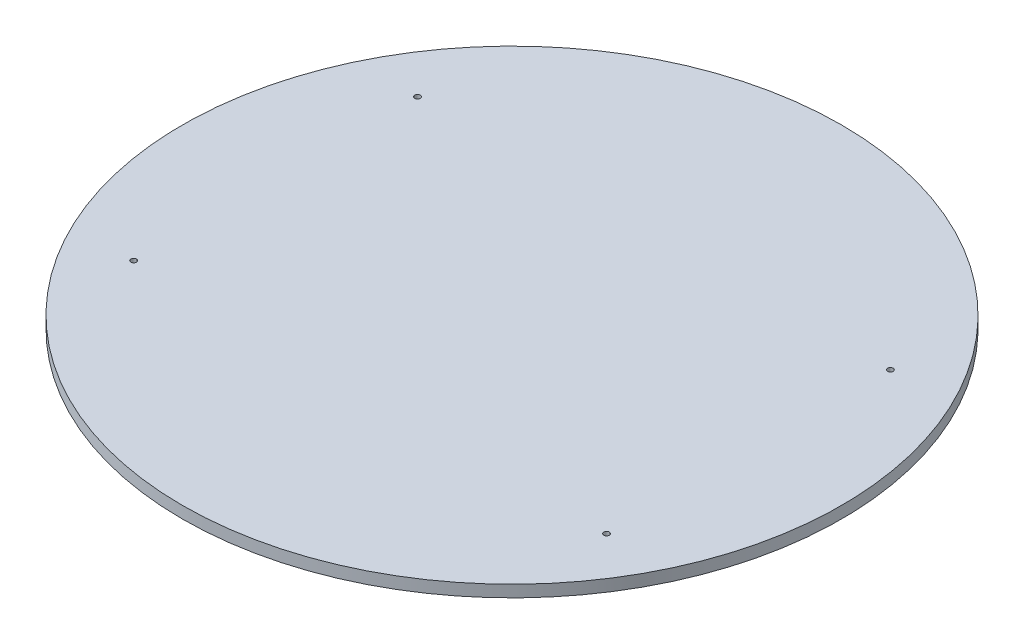
ISO-10303-21;
HEADER;
FILE_DESCRIPTION(('STEP AP214'),'2;1');
FILE_NAME('part.step','',(''),(''),'','','');
FILE_SCHEMA(('AUTOMOTIVE_DESIGN { 1 0 10303 214 1 1 1 1 }'));
ENDSEC;
DATA;
#1=APPLICATION_CONTEXT('core data for automotive mechanical design processes');
#2=APPLICATION_PROTOCOL_DEFINITION('international standard','automotive_design',2000,#1);
#3=PRODUCT_CONTEXT('',#1,'mechanical');
#4=PRODUCT('Part','Part','',(#3));
#5=PRODUCT_RELATED_PRODUCT_CATEGORY('part','',(#4));
#6=PRODUCT_DEFINITION_FORMATION('','',#4);
#7=PRODUCT_DEFINITION_CONTEXT('part definition',#1,'design');
#8=PRODUCT_DEFINITION('design','',#6,#7);
#9=PRODUCT_DEFINITION_SHAPE('','',#8);
#10=(LENGTH_UNIT() NAMED_UNIT(*) SI_UNIT(.MILLI.,.METRE.));
#11=(NAMED_UNIT(*) PLANE_ANGLE_UNIT() SI_UNIT($,.RADIAN.));
#12=(NAMED_UNIT(*) SI_UNIT($,.STERADIAN.) SOLID_ANGLE_UNIT());
#13=UNCERTAINTY_MEASURE_WITH_UNIT(LENGTH_MEASURE(1.E-05),#10,'distance_accuracy_value','');
#14=(GEOMETRIC_REPRESENTATION_CONTEXT(3) GLOBAL_UNCERTAINTY_ASSIGNED_CONTEXT((#13)) GLOBAL_UNIT_ASSIGNED_CONTEXT((#10,
#11,#12)) REPRESENTATION_CONTEXT('',''));
#15=CARTESIAN_POINT('',(0.,0.,0.));
#16=DIRECTION('',(0.,0.,1.));
#17=DIRECTION('',(1.,0.,0.));
#18=AXIS2_PLACEMENT_3D('',#15,#16,#17);
#19=CARTESIAN_POINT('',(0.,6.35,0.));
#20=DIRECTION('',(0.,1.,0.));
#21=DIRECTION('',(0.,0.,1.));
#22=AXIS2_PLACEMENT_3D('',#19,#20,#21);
#23=PLANE('',#22);
#24=CARTESIAN_POINT('',(127.,6.35,-76.2));
#25=DIRECTION('',(0.,1.,0.));
#26=DIRECTION('',(0.,0.,1.));
#27=AXIS2_PLACEMENT_3D('',#24,#25,#26);
#28=CIRCLE('',#27,1.5);
#29=CARTESIAN_POINT('',(127.,6.35,-74.7));
#30=VERTEX_POINT('',#29);
#31=EDGE_CURVE('E57',#30,#30,#28,.T.);
#32=ORIENTED_EDGE('',*,*,#31,.F.);
#33=EDGE_LOOP('',(#32));
#34=FACE_BOUND('',#33,.T.);
#35=CARTESIAN_POINT('',(-127.,6.35,76.2));
#36=DIRECTION('',(0.,1.,0.));
#37=DIRECTION('',(0.,0.,1.));
#38=AXIS2_PLACEMENT_3D('',#35,#36,#37);
#39=CIRCLE('',#38,1.5);
#40=CARTESIAN_POINT('',(-127.,6.35,77.7));
#41=VERTEX_POINT('',#40);
#42=EDGE_CURVE('E46',#41,#41,#39,.T.);
#43=ORIENTED_EDGE('',*,*,#42,.F.);
#44=EDGE_LOOP('',(#43));
#45=FACE_BOUND('',#44,.T.);
#46=CARTESIAN_POINT('',(0.,6.35,0.));
#47=DIRECTION('',(0.,1.,0.));
#48=DIRECTION('',(0.,0.,1.));
#49=AXIS2_PLACEMENT_3D('',#46,#47,#48);
#50=CIRCLE('',#49,177.);
#51=CARTESIAN_POINT('',(0.,6.35,177.));
#52=VERTEX_POINT('',#51);
#53=EDGE_CURVE('E10',#52,#52,#50,.T.);
#54=ORIENTED_EDGE('',*,*,#53,.T.);
#55=EDGE_LOOP('',(#54));
#56=FACE_BOUND('',#55,.T.);
#57=CARTESIAN_POINT('',(-127.,6.35,-76.2));
#58=DIRECTION('',(0.,1.,0.));
#59=DIRECTION('',(0.,0.,1.));
#60=AXIS2_PLACEMENT_3D('',#57,#58,#59);
#61=CIRCLE('',#60,1.5);
#62=CARTESIAN_POINT('',(-127.,6.35,-74.7));
#63=VERTEX_POINT('',#62);
#64=EDGE_CURVE('E51',#63,#63,#61,.T.);
#65=ORIENTED_EDGE('',*,*,#64,.F.);
#66=EDGE_LOOP('',(#65));
#67=FACE_BOUND('',#66,.T.);
#68=CARTESIAN_POINT('',(127.,6.35,76.2));
#69=DIRECTION('',(0.,1.,0.));
#70=DIRECTION('',(0.,0.,1.));
#71=AXIS2_PLACEMENT_3D('',#68,#69,#70);
#72=CIRCLE('',#71,1.5);
#73=CARTESIAN_POINT('',(127.,6.35,77.7));
#74=VERTEX_POINT('',#73);
#75=EDGE_CURVE('E63',#74,#74,#72,.T.);
#76=ORIENTED_EDGE('',*,*,#75,.F.);
#77=EDGE_LOOP('',(#76));
#78=FACE_BOUND('',#77,.T.);
#79=ADVANCED_FACE('F35',(#34,#45,#56,#67,#78),#23,.T.);
#80=CARTESIAN_POINT('',(0.,0.,0.));
#81=DIRECTION('',(0.,1.,0.));
#82=DIRECTION('',(0.,0.,1.));
#83=AXIS2_PLACEMENT_3D('',#80,#81,#82);
#84=PLANE('',#83);
#85=CARTESIAN_POINT('',(0.,0.,0.));
#86=DIRECTION('',(0.,1.,0.));
#87=DIRECTION('',(0.,0.,1.));
#88=AXIS2_PLACEMENT_3D('',#85,#86,#87);
#89=CIRCLE('',#88,177.);
#90=CARTESIAN_POINT('',(0.,0.,177.));
#91=VERTEX_POINT('',#90);
#92=EDGE_CURVE('E39',#91,#91,#89,.T.);
#93=ORIENTED_EDGE('',*,*,#92,.F.);
#94=EDGE_LOOP('',(#93));
#95=FACE_BOUND('',#94,.T.);
#96=CARTESIAN_POINT('',(-127.,0.,76.2));
#97=DIRECTION('',(0.,1.,0.));
#98=DIRECTION('',(0.,0.,1.));
#99=AXIS2_PLACEMENT_3D('',#96,#97,#98);
#100=CIRCLE('',#99,1.5);
#101=CARTESIAN_POINT('',(-127.,0.,77.7));
#102=VERTEX_POINT('',#101);
#103=EDGE_CURVE('E48',#102,#102,#100,.T.);
#104=ORIENTED_EDGE('',*,*,#103,.T.);
#105=EDGE_LOOP('',(#104));
#106=FACE_BOUND('',#105,.T.);
#107=CARTESIAN_POINT('',(-127.,0.,-76.2));
#108=DIRECTION('',(0.,1.,0.));
#109=DIRECTION('',(0.,0.,1.));
#110=AXIS2_PLACEMENT_3D('',#107,#108,#109);
#111=CIRCLE('',#110,1.5);
#112=CARTESIAN_POINT('',(-127.,0.,-74.7));
#113=VERTEX_POINT('',#112);
#114=EDGE_CURVE('E54',#113,#113,#111,.T.);
#115=ORIENTED_EDGE('',*,*,#114,.T.);
#116=EDGE_LOOP('',(#115));
#117=FACE_BOUND('',#116,.T.);
#118=CARTESIAN_POINT('',(127.,0.,-76.2));
#119=DIRECTION('',(0.,1.,0.));
#120=DIRECTION('',(0.,0.,1.));
#121=AXIS2_PLACEMENT_3D('',#118,#119,#120);
#122=CIRCLE('',#121,1.5);
#123=CARTESIAN_POINT('',(127.,0.,-74.7));
#124=VERTEX_POINT('',#123);
#125=EDGE_CURVE('E60',#124,#124,#122,.T.);
#126=ORIENTED_EDGE('',*,*,#125,.T.);
#127=EDGE_LOOP('',(#126));
#128=FACE_BOUND('',#127,.T.);
#129=CARTESIAN_POINT('',(127.,0.,76.2));
#130=DIRECTION('',(0.,1.,0.));
#131=DIRECTION('',(0.,0.,1.));
#132=AXIS2_PLACEMENT_3D('',#129,#130,#131);
#133=CIRCLE('',#132,1.5);
#134=CARTESIAN_POINT('',(127.,0.,77.7));
#135=VERTEX_POINT('',#134);
#136=EDGE_CURVE('E66',#135,#135,#133,.T.);
#137=ORIENTED_EDGE('',*,*,#136,.T.);
#138=EDGE_LOOP('',(#137));
#139=FACE_BOUND('',#138,.T.);
#140=ADVANCED_FACE('F76',(#95,#106,#117,#128,#139),#84,.F.);
#141=CARTESIAN_POINT('',(0.,6.35,0.));
#142=DIRECTION('',(0.,-1.,0.));
#143=DIRECTION('',(0.,0.,-1.));
#144=AXIS2_PLACEMENT_3D('',#141,#142,#143);
#145=CYLINDRICAL_SURFACE('',#144,177.);
#146=ORIENTED_EDGE('',*,*,#53,.F.);
#147=EDGE_LOOP('',(#146));
#148=FACE_BOUND('',#147,.T.);
#149=ORIENTED_EDGE('',*,*,#92,.T.);
#150=EDGE_LOOP('',(#149));
#151=FACE_BOUND('',#150,.T.);
#152=ADVANCED_FACE('F37',(#148,#151),#145,.T.);
#153=CARTESIAN_POINT('',(-127.,6.35,76.2));
#154=DIRECTION('',(0.,-1.,0.));
#155=DIRECTION('',(0.,0.,-1.));
#156=AXIS2_PLACEMENT_3D('',#153,#154,#155);
#157=CYLINDRICAL_SURFACE('',#156,1.5);
#158=ORIENTED_EDGE('',*,*,#42,.T.);
#159=EDGE_LOOP('',(#158));
#160=FACE_BOUND('',#159,.T.);
#161=ORIENTED_EDGE('',*,*,#103,.F.);
#162=EDGE_LOOP('',(#161));
#163=FACE_BOUND('',#162,.T.);
#164=ADVANCED_FACE('F86',(#160,#163),#157,.F.);
#165=CARTESIAN_POINT('',(-127.,6.35,-76.2));
#166=DIRECTION('',(0.,-1.,0.));
#167=DIRECTION('',(0.,0.,-1.));
#168=AXIS2_PLACEMENT_3D('',#165,#166,#167);
#169=CYLINDRICAL_SURFACE('',#168,1.5);
#170=ORIENTED_EDGE('',*,*,#64,.T.);
#171=EDGE_LOOP('',(#170));
#172=FACE_BOUND('',#171,.T.);
#173=ORIENTED_EDGE('',*,*,#114,.F.);
#174=EDGE_LOOP('',(#173));
#175=FACE_BOUND('',#174,.T.);
#176=ADVANCED_FACE('F89',(#172,#175),#169,.F.);
#177=CARTESIAN_POINT('',(127.,6.35,-76.2));
#178=DIRECTION('',(0.,-1.,0.));
#179=DIRECTION('',(0.,0.,-1.));
#180=AXIS2_PLACEMENT_3D('',#177,#178,#179);
#181=CYLINDRICAL_SURFACE('',#180,1.5);
#182=ORIENTED_EDGE('',*,*,#31,.T.);
#183=EDGE_LOOP('',(#182));
#184=FACE_BOUND('',#183,.T.);
#185=ORIENTED_EDGE('',*,*,#125,.F.);
#186=EDGE_LOOP('',(#185));
#187=FACE_BOUND('',#186,.T.);
#188=ADVANCED_FACE('F93',(#184,#187),#181,.F.);
#189=CARTESIAN_POINT('',(127.,6.35,76.2));
#190=DIRECTION('',(0.,-1.,0.));
#191=DIRECTION('',(0.,0.,-1.));
#192=AXIS2_PLACEMENT_3D('',#189,#190,#191);
#193=CYLINDRICAL_SURFACE('',#192,1.5);
#194=ORIENTED_EDGE('',*,*,#75,.T.);
#195=EDGE_LOOP('',(#194));
#196=FACE_BOUND('',#195,.T.);
#197=ORIENTED_EDGE('',*,*,#136,.F.);
#198=EDGE_LOOP('',(#197));
#199=FACE_BOUND('',#198,.T.);
#200=ADVANCED_FACE('F72',(#196,#199),#193,.F.);
#201=CLOSED_SHELL('',(#79,#140,#152,#164,#176,#188,#200));
#202=MANIFOLD_SOLID_BREP('B2',#201);
#203=ADVANCED_BREP_SHAPE_REPRESENTATION('',(#18,#202),#14);
#204=SHAPE_DEFINITION_REPRESENTATION(#9,#203);
ENDSEC;
END-ISO-10303-21;
